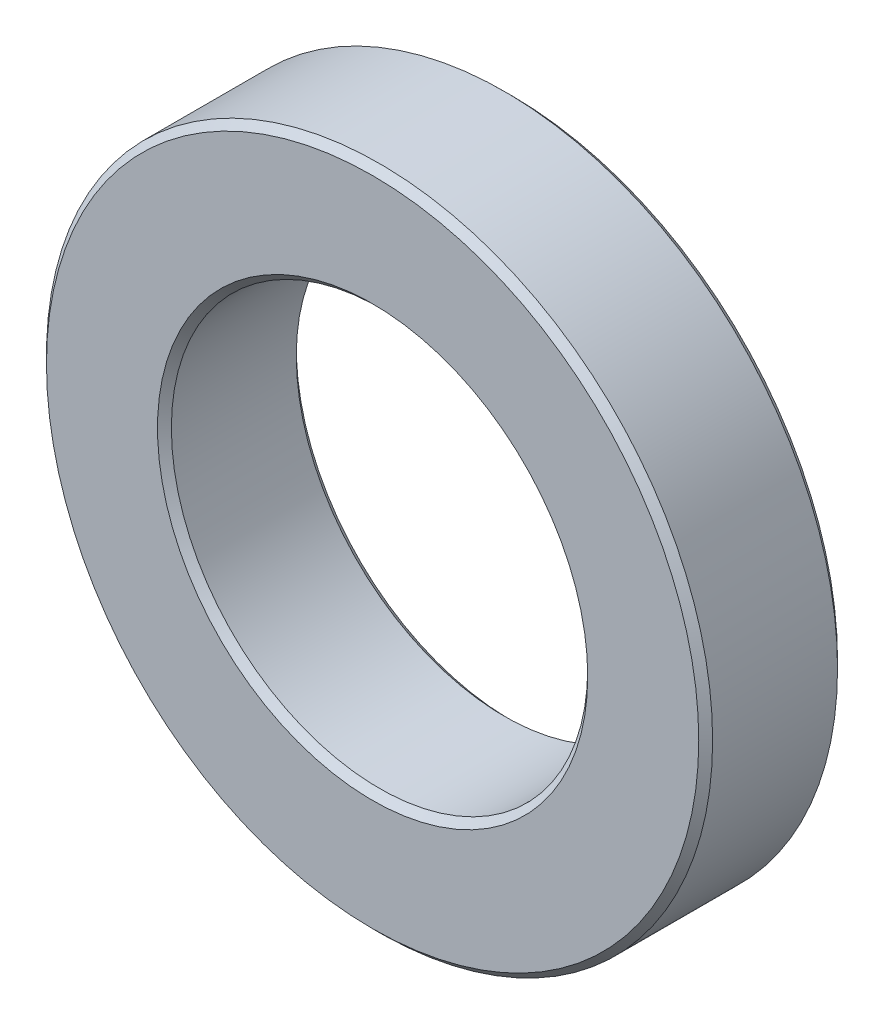
ISO-10303-21;
HEADER;
FILE_DESCRIPTION(('STEP AP214'),'2;1');
FILE_NAME('part.step','',(''),(''),'','','');
FILE_SCHEMA(('AUTOMOTIVE_DESIGN { 1 0 10303 214 1 1 1 1 }'));
ENDSEC;
DATA;
#1=APPLICATION_CONTEXT('core data for automotive mechanical design processes');
#2=APPLICATION_PROTOCOL_DEFINITION('international standard','automotive_design',2000,#1);
#3=PRODUCT_CONTEXT('',#1,'mechanical');
#4=PRODUCT('Part','Part','',(#3));
#5=PRODUCT_RELATED_PRODUCT_CATEGORY('part','',(#4));
#6=PRODUCT_DEFINITION_FORMATION('','',#4);
#7=PRODUCT_DEFINITION_CONTEXT('part definition',#1,'design');
#8=PRODUCT_DEFINITION('design','',#6,#7);
#9=PRODUCT_DEFINITION_SHAPE('','',#8);
#10=(LENGTH_UNIT() NAMED_UNIT(*) SI_UNIT(.MILLI.,.METRE.));
#11=(NAMED_UNIT(*) PLANE_ANGLE_UNIT() SI_UNIT($,.RADIAN.));
#12=(NAMED_UNIT(*) SI_UNIT($,.STERADIAN.) SOLID_ANGLE_UNIT());
#13=UNCERTAINTY_MEASURE_WITH_UNIT(LENGTH_MEASURE(1.E-05),#10,'distance_accuracy_value','');
#14=(GEOMETRIC_REPRESENTATION_CONTEXT(3) GLOBAL_UNCERTAINTY_ASSIGNED_CONTEXT((#13)) GLOBAL_UNIT_ASSIGNED_CONTEXT((#10,
#11,#12)) REPRESENTATION_CONTEXT('',''));
#15=CARTESIAN_POINT('',(0.,0.,0.));
#16=DIRECTION('',(0.,0.,1.));
#17=DIRECTION('',(1.,0.,0.));
#18=AXIS2_PLACEMENT_3D('',#15,#16,#17);
#19=CARTESIAN_POINT('',(0.,0.,5.));
#20=DIRECTION('',(0.,0.,1.));
#21=DIRECTION('',(1.,0.,0.));
#22=AXIS2_PLACEMENT_3D('',#19,#20,#21);
#23=PLANE('',#22);
#24=CARTESIAN_POINT('',(0.,0.,5.));
#25=DIRECTION('',(0.,0.,1.));
#26=DIRECTION('',(1.,0.,0.));
#27=AXIS2_PLACEMENT_3D('',#24,#25,#26);
#28=CIRCLE('',#27,11.75);
#29=CARTESIAN_POINT('',(11.75,0.,5.));
#30=VERTEX_POINT('',#29);
#31=EDGE_CURVE('E43',#30,#30,#28,.T.);
#32=ORIENTED_EDGE('',*,*,#31,.T.);
#33=EDGE_LOOP('',(#32));
#34=FACE_BOUND('',#33,.T.);
#35=CARTESIAN_POINT('',(0.,0.,5.));
#36=DIRECTION('',(0.,0.,1.));
#37=DIRECTION('',(1.,0.,0.));
#38=AXIS2_PLACEMENT_3D('',#35,#36,#37);
#39=CIRCLE('',#38,7.75000000000001);
#40=CARTESIAN_POINT('',(7.75000000000001,0.,5.));
#41=VERTEX_POINT('',#40);
#42=EDGE_CURVE('E47',#41,#41,#39,.F.);
#43=ORIENTED_EDGE('',*,*,#42,.T.);
#44=EDGE_LOOP('',(#43));
#45=FACE_BOUND('',#44,.T.);
#46=ADVANCED_FACE('F32',(#34,#45),#23,.T.);
#47=CARTESIAN_POINT('',(0.,0.,0.));
#48=DIRECTION('',(0.,0.,1.));
#49=DIRECTION('',(1.,0.,0.));
#50=AXIS2_PLACEMENT_3D('',#47,#48,#49);
#51=PLANE('',#50);
#52=CARTESIAN_POINT('',(0.,0.,0.));
#53=DIRECTION('',(0.,0.,1.));
#54=DIRECTION('',(1.,0.,0.));
#55=AXIS2_PLACEMENT_3D('',#52,#53,#54);
#56=CIRCLE('',#55,11.75);
#57=CARTESIAN_POINT('',(11.75,0.,0.));
#58=VERTEX_POINT('',#57);
#59=EDGE_CURVE('E52',#58,#58,#56,.F.);
#60=ORIENTED_EDGE('',*,*,#59,.T.);
#61=EDGE_LOOP('',(#60));
#62=FACE_BOUND('',#61,.T.);
#63=CARTESIAN_POINT('',(0.,0.,0.));
#64=DIRECTION('',(0.,0.,1.));
#65=DIRECTION('',(1.,0.,0.));
#66=AXIS2_PLACEMENT_3D('',#63,#64,#65);
#67=CIRCLE('',#66,7.74999999999999);
#68=CARTESIAN_POINT('',(7.74999999999999,0.,0.));
#69=VERTEX_POINT('',#68);
#70=EDGE_CURVE('E55',#69,#69,#67,.T.);
#71=ORIENTED_EDGE('',*,*,#70,.T.);
#72=EDGE_LOOP('',(#71));
#73=FACE_BOUND('',#72,.T.);
#74=ADVANCED_FACE('F77',(#62,#73),#51,.F.);
#75=CARTESIAN_POINT('',(0.,0.,5.));
#76=DIRECTION('',(0.,0.,-1.));
#77=DIRECTION('',(-1.,0.,0.));
#78=AXIS2_PLACEMENT_3D('',#75,#76,#77);
#79=CYLINDRICAL_SURFACE('',#78,12.);
#80=CARTESIAN_POINT('',(0.,0.,0.249999999999997));
#81=DIRECTION('',(0.,0.,1.));
#82=DIRECTION('',(1.,0.,0.));
#83=AXIS2_PLACEMENT_3D('',#80,#81,#82);
#84=CIRCLE('',#83,12.);
#85=CARTESIAN_POINT('',(12.,0.,0.249999999999997));
#86=VERTEX_POINT('',#85);
#87=EDGE_CURVE('E58',#86,#86,#84,.T.);
#88=ORIENTED_EDGE('',*,*,#87,.T.);
#89=EDGE_LOOP('',(#88));
#90=FACE_BOUND('',#89,.T.);
#91=CARTESIAN_POINT('',(0.,0.,4.75));
#92=DIRECTION('',(0.,0.,1.));
#93=DIRECTION('',(1.,0.,0.));
#94=AXIS2_PLACEMENT_3D('',#91,#92,#93);
#95=CIRCLE('',#94,12.);
#96=CARTESIAN_POINT('',(12.,0.,4.75));
#97=VERTEX_POINT('',#96);
#98=EDGE_CURVE('E61',#97,#97,#95,.F.);
#99=ORIENTED_EDGE('',*,*,#98,.T.);
#100=EDGE_LOOP('',(#99));
#101=FACE_BOUND('',#100,.T.);
#102=ADVANCED_FACE('F65',(#90,#101),#79,.T.);
#103=CARTESIAN_POINT('',(0.,0.,5.));
#104=DIRECTION('',(0.,0.,-1.));
#105=DIRECTION('',(-1.,0.,0.));
#106=AXIS2_PLACEMENT_3D('',#103,#104,#105);
#107=CYLINDRICAL_SURFACE('',#106,7.5);
#108=CARTESIAN_POINT('',(0.,0.,0.249999999999995));
#109=DIRECTION('',(0.,0.,1.));
#110=DIRECTION('',(1.,0.,0.));
#111=AXIS2_PLACEMENT_3D('',#108,#109,#110);
#112=CIRCLE('',#111,7.5);
#113=CARTESIAN_POINT('',(7.5,0.,0.249999999999995));
#114=VERTEX_POINT('',#113);
#115=EDGE_CURVE('E10',#114,#114,#112,.F.);
#116=ORIENTED_EDGE('',*,*,#115,.T.);
#117=EDGE_LOOP('',(#116));
#118=FACE_BOUND('',#117,.T.);
#119=CARTESIAN_POINT('',(0.,0.,4.74999999999999));
#120=DIRECTION('',(0.,0.,1.));
#121=DIRECTION('',(1.,0.,0.));
#122=AXIS2_PLACEMENT_3D('',#119,#120,#121);
#123=CIRCLE('',#122,7.5);
#124=CARTESIAN_POINT('',(7.5,0.,4.74999999999999));
#125=VERTEX_POINT('',#124);
#126=EDGE_CURVE('E39',#125,#125,#123,.T.);
#127=ORIENTED_EDGE('',*,*,#126,.T.);
#128=EDGE_LOOP('',(#127));
#129=FACE_BOUND('',#128,.T.);
#130=ADVANCED_FACE('F93',(#118,#129),#107,.F.);
#131=CARTESIAN_POINT('',(0.,0.,0.249999999999997));
#132=DIRECTION('',(0.,0.,1.));
#133=DIRECTION('',(1.,0.,0.));
#134=AXIS2_PLACEMENT_3D('',#131,#132,#133);
#135=CONICAL_SURFACE('',#134,12.,0.785398163397448);
#136=ORIENTED_EDGE('',*,*,#59,.F.);
#137=EDGE_LOOP('',(#136));
#138=FACE_BOUND('',#137,.T.);
#139=ORIENTED_EDGE('',*,*,#87,.F.);
#140=EDGE_LOOP('',(#139));
#141=FACE_BOUND('',#140,.T.);
#142=ADVANCED_FACE('F71',(#138,#141),#135,.T.);
#143=CARTESIAN_POINT('',(0.,0.,5.));
#144=DIRECTION('',(0.,0.,-1.));
#145=DIRECTION('',(-1.,0.,0.));
#146=AXIS2_PLACEMENT_3D('',#143,#144,#145);
#147=CONICAL_SURFACE('',#146,11.75,0.785398163397445);
#148=ORIENTED_EDGE('',*,*,#98,.F.);
#149=EDGE_LOOP('',(#148));
#150=FACE_BOUND('',#149,.T.);
#151=ORIENTED_EDGE('',*,*,#31,.F.);
#152=EDGE_LOOP('',(#151));
#153=FACE_BOUND('',#152,.T.);
#154=ADVANCED_FACE('F67',(#150,#153),#147,.T.);
#155=CARTESIAN_POINT('',(0.,0.,0.));
#156=DIRECTION('',(0.,0.,-1.));
#157=DIRECTION('',(-1.,0.,0.));
#158=AXIS2_PLACEMENT_3D('',#155,#156,#157);
#159=CONICAL_SURFACE('',#158,7.74999999999999,0.785398163397443);
#160=ORIENTED_EDGE('',*,*,#115,.F.);
#161=EDGE_LOOP('',(#160));
#162=FACE_BOUND('',#161,.T.);
#163=ORIENTED_EDGE('',*,*,#70,.F.);
#164=EDGE_LOOP('',(#163));
#165=FACE_BOUND('',#164,.T.);
#166=ADVANCED_FACE('F70',(#162,#165),#159,.F.);
#167=CARTESIAN_POINT('',(0.,0.,4.74999999999999));
#168=DIRECTION('',(0.,0.,1.));
#169=DIRECTION('',(1.,0.,0.));
#170=AXIS2_PLACEMENT_3D('',#167,#168,#169);
#171=CONICAL_SURFACE('',#170,7.5,0.785398163397452);
#172=CARTESIAN_POINT('',(7.75000000000001,0.,5.));
#173=CARTESIAN_POINT('',(7.74739583333334,0.,4.99739583333333));
#174=CARTESIAN_POINT('',(7.74479166666668,0.,4.99479166666667));
#175=CARTESIAN_POINT('',(7.73958333333334,0.,4.98958333333333));
#176=CARTESIAN_POINT('',(7.73697916666668,0.,4.98697916666667));
#177=CARTESIAN_POINT('',(7.73177083333334,0.,4.98177083333333));
#178=CARTESIAN_POINT('',(7.72916666666668,0.,4.97916666666667));
#179=CARTESIAN_POINT('',(7.72395833333334,0.,4.97395833333333));
#180=CARTESIAN_POINT('',(7.72135416666668,0.,4.97135416666667));
#181=CARTESIAN_POINT('',(7.71614583333334,0.,4.96614583333333));
#182=CARTESIAN_POINT('',(7.71354166666668,0.,4.96354166666666));
#183=CARTESIAN_POINT('',(7.70833333333334,0.,4.95833333333333));
#184=CARTESIAN_POINT('',(7.70572916666668,0.,4.95572916666666));
#185=CARTESIAN_POINT('',(7.70052083333334,0.,4.95052083333333));
#186=CARTESIAN_POINT('',(7.69791666666667,0.,4.94791666666666));
#187=CARTESIAN_POINT('',(7.69270833333334,0.,4.94270833333333));
#188=CARTESIAN_POINT('',(7.69010416666667,0.,4.94010416666666));
#189=CARTESIAN_POINT('',(7.68489583333334,0.,4.93489583333333));
#190=CARTESIAN_POINT('',(7.68229166666667,0.,4.93229166666666));
#191=CARTESIAN_POINT('',(7.67708333333334,0.,4.92708333333333));
#192=CARTESIAN_POINT('',(7.67447916666667,0.,4.92447916666666));
#193=CARTESIAN_POINT('',(7.66927083333334,0.,4.91927083333333));
#194=CARTESIAN_POINT('',(7.66666666666667,0.,4.91666666666666));
#195=CARTESIAN_POINT('',(7.66145833333334,0.,4.91145833333333));
#196=CARTESIAN_POINT('',(7.65885416666667,0.,4.90885416666666));
#197=CARTESIAN_POINT('',(7.65364583333334,0.,4.90364583333333));
#198=CARTESIAN_POINT('',(7.65104166666667,0.,4.90104166666666));
#199=CARTESIAN_POINT('',(7.64583333333334,0.,4.89583333333333));
#200=CARTESIAN_POINT('',(7.64322916666667,0.,4.89322916666666));
#201=CARTESIAN_POINT('',(7.63802083333334,0.,4.88802083333333));
#202=CARTESIAN_POINT('',(7.63541666666667,0.,4.88541666666666));
#203=CARTESIAN_POINT('',(7.63020833333334,0.,4.88020833333333));
#204=CARTESIAN_POINT('',(7.62760416666667,0.,4.87760416666666));
#205=CARTESIAN_POINT('',(7.62239583333334,0.,4.87239583333333));
#206=CARTESIAN_POINT('',(7.61979166666667,0.,4.86979166666666));
#207=CARTESIAN_POINT('',(7.61458333333334,0.,4.86458333333333));
#208=CARTESIAN_POINT('',(7.61197916666667,0.,4.86197916666666));
#209=CARTESIAN_POINT('',(7.60677083333334,0.,4.85677083333333));
#210=CARTESIAN_POINT('',(7.60416666666667,0.,4.85416666666666));
#211=CARTESIAN_POINT('',(7.59895833333334,0.,4.84895833333333));
#212=CARTESIAN_POINT('',(7.59635416666667,0.,4.84635416666666));
#213=CARTESIAN_POINT('',(7.59114583333334,0.,4.84114583333333));
#214=CARTESIAN_POINT('',(7.58854166666667,0.,4.83854166666666));
#215=CARTESIAN_POINT('',(7.58333333333334,0.,4.83333333333333));
#216=CARTESIAN_POINT('',(7.58072916666667,0.,4.83072916666666));
#217=CARTESIAN_POINT('',(7.57552083333334,0.,4.82552083333333));
#218=CARTESIAN_POINT('',(7.57291666666667,0.,4.82291666666666));
#219=CARTESIAN_POINT('',(7.56770833333334,0.,4.81770833333333));
#220=CARTESIAN_POINT('',(7.56510416666667,0.,4.81510416666666));
#221=CARTESIAN_POINT('',(7.55989583333334,0.,4.80989583333333));
#222=CARTESIAN_POINT('',(7.55729166666667,0.,4.80729166666666));
#223=CARTESIAN_POINT('',(7.55208333333333,0.,4.80208333333333));
#224=CARTESIAN_POINT('',(7.54947916666667,0.,4.79947916666666));
#225=CARTESIAN_POINT('',(7.54427083333333,0.,4.79427083333333));
#226=CARTESIAN_POINT('',(7.54166666666667,0.,4.79166666666666));
#227=CARTESIAN_POINT('',(7.53645833333333,0.,4.78645833333333));
#228=CARTESIAN_POINT('',(7.53385416666667,0.,4.78385416666666));
#229=CARTESIAN_POINT('',(7.52864583333333,0.,4.77864583333333));
#230=CARTESIAN_POINT('',(7.52604166666667,0.,4.77604166666666));
#231=CARTESIAN_POINT('',(7.52083333333333,0.,4.77083333333332));
#232=CARTESIAN_POINT('',(7.51822916666667,0.,4.76822916666666));
#233=CARTESIAN_POINT('',(7.51302083333333,0.,4.76302083333332));
#234=CARTESIAN_POINT('',(7.51041666666667,0.,4.76041666666666));
#235=CARTESIAN_POINT('',(7.50520833333333,0.,4.75520833333332));
#236=CARTESIAN_POINT('',(7.50260416666667,0.,4.75260416666666));
#237=CARTESIAN_POINT('',(7.5,0.,4.74999999999999));
#238=B_SPLINE_CURVE_WITH_KNOTS('',3,(#172,#173,#174,#175,#176,#177,#178,#179,#180,#181,#182,
#183,#184,#185,#186,#187,#188,#189,#190,#191,#192,#193,#194,#195,#196,#197,#198,#199,#200,#201,
#202,#203,#204,#205,#206,#207,#208,#209,#210,#211,#212,#213,#214,#215,#216,#217,#218,#219,#220,
#221,#222,#223,#224,#225,#226,#227,#228,#229,#230,#231,#232,#233,#234,#235,#236,#237),
.UNSPECIFIED.,.F.,.F.,(4,2,2,2,2,2,2,2,2,2,2,2,2,2,2,2,2,2,2,2,2,2,2,2,2,2,2,2,2,2,2,2,4),(0.,
0.011048543456041,0.0220970869120809,0.0331456303681213,0.0441941738241617,0.0552427172802015,
0.0662912607362426,0.0773398041922824,0.0883883476483228,0.0994368911043632,0.110485434560403,
0.121533978016444,0.132582521472484,0.143631064928524,0.154679608384564,0.165728151840605,
0.176776695296645,0.187825238752685,0.198873782208726,0.209922325664766,0.220970869120806,
0.232019412576847,0.243067956032886,0.254116499488927,0.265165042944967,0.276213586401008,
0.287262129857047,0.298310673313088,0.309359216769128,0.320407760225168,0.331456303681209,
0.342504847137249,0.353553390593289),.UNSPECIFIED.);
#239=EDGE_CURVE('BSEAM34',#41,#125,#238,.T.);
#240=ORIENTED_EDGE('',*,*,#42,.F.);
#241=ORIENTED_EDGE('',*,*,#126,.F.);
#242=ORIENTED_EDGE('',*,*,#239,.T.);
#243=ORIENTED_EDGE('',*,*,#239,.F.);
#244=EDGE_LOOP('',(#240,#242,#241,#243));
#245=FACE_BOUND('',#244,.T.);
#246=ADVANCED_FACE('F34',(#245),#171,.F.);
#247=CLOSED_SHELL('',(#46,#74,#102,#130,#142,#154,#166,#246));
#248=MANIFOLD_SOLID_BREP('B2',#247);
#249=ADVANCED_BREP_SHAPE_REPRESENTATION('',(#18,#248),#14);
#250=SHAPE_DEFINITION_REPRESENTATION(#9,#249);
ENDSEC;
END-ISO-10303-21;
